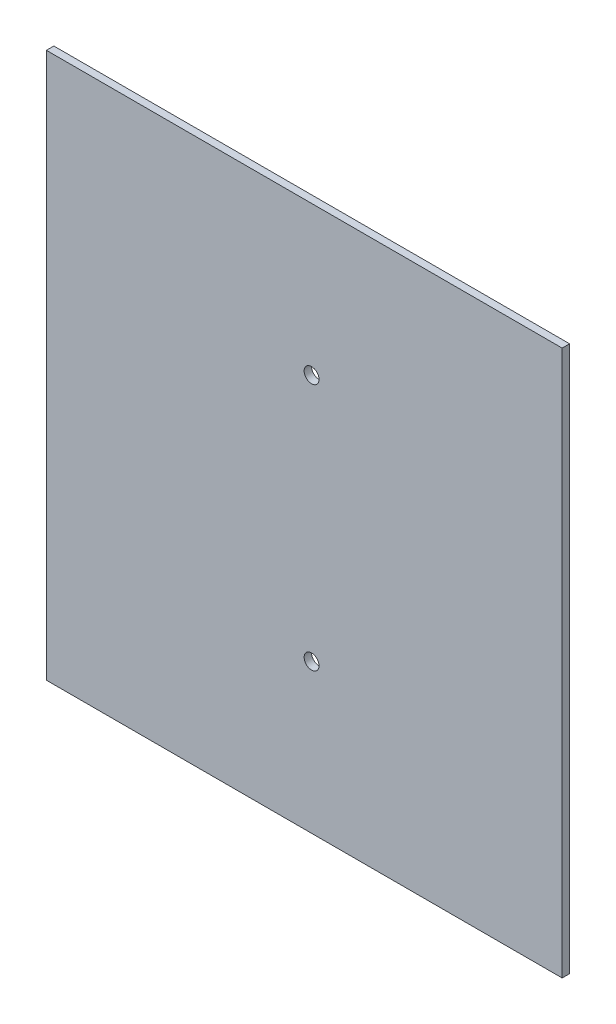
ISO-10303-21;
HEADER;
FILE_DESCRIPTION(('STEP AP214'),'2;1');
FILE_NAME('part.step','',(''),(''),'','','');
FILE_SCHEMA(('AUTOMOTIVE_DESIGN { 1 0 10303 214 1 1 1 1 }'));
ENDSEC;
DATA;
#1=APPLICATION_CONTEXT('core data for automotive mechanical design processes');
#2=APPLICATION_PROTOCOL_DEFINITION('international standard','automotive_design',2000,#1);
#3=PRODUCT_CONTEXT('',#1,'mechanical');
#4=PRODUCT('Part','Part','',(#3));
#5=PRODUCT_RELATED_PRODUCT_CATEGORY('part','',(#4));
#6=PRODUCT_DEFINITION_FORMATION('','',#4);
#7=PRODUCT_DEFINITION_CONTEXT('part definition',#1,'design');
#8=PRODUCT_DEFINITION('design','',#6,#7);
#9=PRODUCT_DEFINITION_SHAPE('','',#8);
#10=(LENGTH_UNIT() NAMED_UNIT(*) SI_UNIT(.MILLI.,.METRE.));
#11=(NAMED_UNIT(*) PLANE_ANGLE_UNIT() SI_UNIT($,.RADIAN.));
#12=(NAMED_UNIT(*) SI_UNIT($,.STERADIAN.) SOLID_ANGLE_UNIT());
#13=UNCERTAINTY_MEASURE_WITH_UNIT(LENGTH_MEASURE(1.E-05),#10,'distance_accuracy_value','');
#14=(GEOMETRIC_REPRESENTATION_CONTEXT(3) GLOBAL_UNCERTAINTY_ASSIGNED_CONTEXT((#13)) GLOBAL_UNIT_ASSIGNED_CONTEXT((#10,
#11,#12)) REPRESENTATION_CONTEXT('',''));
#15=CARTESIAN_POINT('',(0.,0.,0.));
#16=DIRECTION('',(0.,0.,1.));
#17=DIRECTION('',(1.,0.,0.));
#18=AXIS2_PLACEMENT_3D('',#15,#16,#17);
#19=CARTESIAN_POINT('',(0.,0.,1.5));
#20=DIRECTION('',(-1.,0.,0.));
#21=DIRECTION('',(0.,0.,1.));
#22=AXIS2_PLACEMENT_3D('',#19,#20,#21);
#23=PLANE('',#22);
#24=DIRECTION('',(0.,1.,0.));
#25=VECTOR('',#24,1.);
#26=CARTESIAN_POINT('',(0.,0.,0.));
#27=LINE('',#26,#25);
#28=CARTESIAN_POINT('',(0.,0.,0.));
#29=VERTEX_POINT('',#28);
#30=CARTESIAN_POINT('',(0.,110.,0.));
#31=VERTEX_POINT('',#30);
#32=EDGE_CURVE('E101',#29,#31,#27,.T.);
#33=ORIENTED_EDGE('',*,*,#32,.F.);
#34=DIRECTION('',(0.,0.,-1.));
#35=VECTOR('',#34,1.);
#36=CARTESIAN_POINT('',(0.,0.,1.5));
#37=LINE('',#36,#35);
#38=CARTESIAN_POINT('',(0.,0.,1.5));
#39=VERTEX_POINT('',#38);
#40=EDGE_CURVE('E11',#39,#29,#37,.T.);
#41=ORIENTED_EDGE('',*,*,#40,.F.);
#42=DIRECTION('',(0.,1.,0.));
#43=VECTOR('',#42,1.);
#44=CARTESIAN_POINT('',(0.,0.,1.5));
#45=LINE('',#44,#43);
#46=CARTESIAN_POINT('',(0.,110.,1.5));
#47=VERTEX_POINT('',#46);
#48=EDGE_CURVE('E95',#39,#47,#45,.T.);
#49=ORIENTED_EDGE('',*,*,#48,.T.);
#50=DIRECTION('',(0.,0.,-1.));
#51=VECTOR('',#50,1.);
#52=CARTESIAN_POINT('',(0.,110.,1.5));
#53=LINE('',#52,#51);
#54=EDGE_CURVE('E74',#47,#31,#53,.T.);
#55=ORIENTED_EDGE('',*,*,#54,.T.);
#56=EDGE_LOOP('',(#33,#41,#49,#55));
#57=FACE_BOUND('',#56,.T.);
#58=ADVANCED_FACE('F33',(#57),#23,.T.);
#59=CARTESIAN_POINT('',(0.,0.,1.5));
#60=DIRECTION('',(0.,1.,0.));
#61=DIRECTION('',(0.,0.,1.));
#62=AXIS2_PLACEMENT_3D('',#59,#60,#61);
#63=PLANE('',#62);
#64=DIRECTION('',(1.,0.,0.));
#65=VECTOR('',#64,1.);
#66=CARTESIAN_POINT('',(0.,0.,0.));
#67=LINE('',#66,#65);
#68=CARTESIAN_POINT('',(104.,0.,0.));
#69=VERTEX_POINT('',#68);
#70=EDGE_CURVE('E66',#29,#69,#67,.T.);
#71=ORIENTED_EDGE('',*,*,#70,.T.);
#72=DIRECTION('',(0.,0.,-1.));
#73=VECTOR('',#72,1.);
#74=CARTESIAN_POINT('',(104.,0.,1.5));
#75=LINE('',#74,#73);
#76=CARTESIAN_POINT('',(104.,0.,1.5));
#77=VERTEX_POINT('',#76);
#78=EDGE_CURVE('E42',#77,#69,#75,.T.);
#79=ORIENTED_EDGE('',*,*,#78,.F.);
#80=DIRECTION('',(1.,0.,0.));
#81=VECTOR('',#80,1.);
#82=CARTESIAN_POINT('',(0.,0.,1.5));
#83=LINE('',#82,#81);
#84=EDGE_CURVE('E84',#39,#77,#83,.T.);
#85=ORIENTED_EDGE('',*,*,#84,.F.);
#86=ORIENTED_EDGE('',*,*,#40,.T.);
#87=EDGE_LOOP('',(#71,#79,#85,#86));
#88=FACE_BOUND('',#87,.T.);
#89=ADVANCED_FACE('F128',(#88),#63,.F.);
#90=CARTESIAN_POINT('',(104.,0.,1.5));
#91=DIRECTION('',(-1.,0.,0.));
#92=DIRECTION('',(0.,0.,1.));
#93=AXIS2_PLACEMENT_3D('',#90,#91,#92);
#94=PLANE('',#93);
#95=DIRECTION('',(0.,1.,0.));
#96=VECTOR('',#95,1.);
#97=CARTESIAN_POINT('',(104.,0.,0.));
#98=LINE('',#97,#96);
#99=CARTESIAN_POINT('',(104.,110.,0.));
#100=VERTEX_POINT('',#99);
#101=EDGE_CURVE('E91',#69,#100,#98,.T.);
#102=ORIENTED_EDGE('',*,*,#101,.T.);
#103=DIRECTION('',(0.,0.,-1.));
#104=VECTOR('',#103,1.);
#105=CARTESIAN_POINT('',(104.,110.,1.5));
#106=LINE('',#105,#104);
#107=CARTESIAN_POINT('',(104.,110.,1.5));
#108=VERTEX_POINT('',#107);
#109=EDGE_CURVE('E88',#108,#100,#106,.T.);
#110=ORIENTED_EDGE('',*,*,#109,.F.);
#111=DIRECTION('',(0.,1.,0.));
#112=VECTOR('',#111,1.);
#113=CARTESIAN_POINT('',(104.,0.,1.5));
#114=LINE('',#113,#112);
#115=EDGE_CURVE('E79',#77,#108,#114,.T.);
#116=ORIENTED_EDGE('',*,*,#115,.F.);
#117=ORIENTED_EDGE('',*,*,#78,.T.);
#118=EDGE_LOOP('',(#102,#110,#116,#117));
#119=FACE_BOUND('',#118,.T.);
#120=ADVANCED_FACE('F89',(#119),#94,.F.);
#121=CARTESIAN_POINT('',(0.,110.,1.5));
#122=DIRECTION('',(0.,1.,0.));
#123=DIRECTION('',(0.,0.,1.));
#124=AXIS2_PLACEMENT_3D('',#121,#122,#123);
#125=PLANE('',#124);
#126=DIRECTION('',(1.,0.,0.));
#127=VECTOR('',#126,1.);
#128=CARTESIAN_POINT('',(0.,110.,0.));
#129=LINE('',#128,#127);
#130=EDGE_CURVE('E104',#31,#100,#129,.T.);
#131=ORIENTED_EDGE('',*,*,#130,.F.);
#132=ORIENTED_EDGE('',*,*,#54,.F.);
#133=DIRECTION('',(1.,0.,0.));
#134=VECTOR('',#133,1.);
#135=CARTESIAN_POINT('',(0.,110.,1.5));
#136=LINE('',#135,#134);
#137=EDGE_CURVE('E83',#47,#108,#136,.T.);
#138=ORIENTED_EDGE('',*,*,#137,.T.);
#139=ORIENTED_EDGE('',*,*,#109,.T.);
#140=EDGE_LOOP('',(#131,#132,#138,#139));
#141=FACE_BOUND('',#140,.T.);
#142=ADVANCED_FACE('F94',(#141),#125,.T.);
#143=CARTESIAN_POINT('',(0.,0.,1.5));
#144=DIRECTION('',(0.,0.,-1.));
#145=DIRECTION('',(-1.,0.,0.));
#146=AXIS2_PLACEMENT_3D('',#143,#144,#145);
#147=PLANE('',#146);
#148=CARTESIAN_POINT('',(53.4720850740263,80.,1.5));
#149=DIRECTION('',(0.,0.,-1.));
#150=DIRECTION('',(0.,1.,0.));
#151=AXIS2_PLACEMENT_3D('',#148,#149,#150);
#152=CIRCLE('',#151,1.5);
#153=CARTESIAN_POINT('',(53.4720850740263,81.5,1.5));
#154=VERTEX_POINT('',#153);
#155=EDGE_CURVE('E172',#154,#154,#152,.T.);
#156=ORIENTED_EDGE('',*,*,#155,.T.);
#157=EDGE_LOOP('',(#156));
#158=FACE_BOUND('',#157,.T.);
#159=CARTESIAN_POINT('',(53.4720850740263,30.,1.50000000000001));
#160=DIRECTION('',(0.,0.,-1.));
#161=DIRECTION('',(0.,1.,0.));
#162=AXIS2_PLACEMENT_3D('',#159,#160,#161);
#163=CIRCLE('',#162,1.5);
#164=CARTESIAN_POINT('',(53.4720850740263,31.5,1.50000000000001));
#165=VERTEX_POINT('',#164);
#166=EDGE_CURVE('E174',#165,#165,#163,.T.);
#167=ORIENTED_EDGE('',*,*,#166,.T.);
#168=EDGE_LOOP('',(#167));
#169=FACE_BOUND('',#168,.T.);
#170=ORIENTED_EDGE('',*,*,#48,.F.);
#171=ORIENTED_EDGE('',*,*,#84,.T.);
#172=ORIENTED_EDGE('',*,*,#115,.T.);
#173=ORIENTED_EDGE('',*,*,#137,.F.);
#174=EDGE_LOOP('',(#170,#171,#172,#173));
#175=FACE_BOUND('',#174,.T.);
#176=ADVANCED_FACE('F82',(#158,#169,#175),#147,.F.);
#177=CARTESIAN_POINT('',(0.,0.,0.));
#178=DIRECTION('',(0.,0.,-1.));
#179=DIRECTION('',(-1.,0.,0.));
#180=AXIS2_PLACEMENT_3D('',#177,#178,#179);
#181=PLANE('',#180);
#182=CARTESIAN_POINT('',(53.4720850740263,80.,0.));
#183=DIRECTION('',(0.,0.,-1.));
#184=DIRECTION('',(-1.,0.,0.));
#185=AXIS2_PLACEMENT_3D('',#182,#183,#184);
#186=CIRCLE('',#185,1.5);
#187=CARTESIAN_POINT('',(51.9720850740263,80.,0.));
#188=VERTEX_POINT('',#187);
#189=EDGE_CURVE('E36',#188,#188,#186,.T.);
#190=ORIENTED_EDGE('',*,*,#189,.F.);
#191=EDGE_LOOP('',(#190));
#192=FACE_BOUND('',#191,.T.);
#193=CARTESIAN_POINT('',(53.4720850740263,30.,0.));
#194=DIRECTION('',(0.,0.,-1.));
#195=DIRECTION('',(-1.,0.,0.));
#196=AXIS2_PLACEMENT_3D('',#193,#194,#195);
#197=CIRCLE('',#196,1.5);
#198=CARTESIAN_POINT('',(51.9720850740263,30.,0.));
#199=VERTEX_POINT('',#198);
#200=EDGE_CURVE('E105',#199,#199,#197,.T.);
#201=ORIENTED_EDGE('',*,*,#200,.F.);
#202=EDGE_LOOP('',(#201));
#203=FACE_BOUND('',#202,.T.);
#204=ORIENTED_EDGE('',*,*,#32,.T.);
#205=ORIENTED_EDGE('',*,*,#130,.T.);
#206=ORIENTED_EDGE('',*,*,#101,.F.);
#207=ORIENTED_EDGE('',*,*,#70,.F.);
#208=EDGE_LOOP('',(#204,#205,#206,#207));
#209=FACE_BOUND('',#208,.T.);
#210=ADVANCED_FACE('F110',(#192,#203,#209),#181,.T.);
#211=CARTESIAN_POINT('',(53.4720850740263,30.,-1.49999999999999));
#212=DIRECTION('',(0.,0.,-1.));
#213=DIRECTION('',(0.,1.,0.));
#214=AXIS2_PLACEMENT_3D('',#211,#212,#213);
#215=CYLINDRICAL_SURFACE('',#214,1.5);
#216=ORIENTED_EDGE('',*,*,#200,.T.);
#217=EDGE_LOOP('',(#216));
#218=FACE_BOUND('',#217,.T.);
#219=ORIENTED_EDGE('',*,*,#166,.F.);
#220=EDGE_LOOP('',(#219));
#221=FACE_BOUND('',#220,.T.);
#222=ADVANCED_FACE('F112',(#218,#221),#215,.F.);
#223=CARTESIAN_POINT('',(53.4720850740263,80.,-1.5));
#224=DIRECTION('',(0.,0.,-1.));
#225=DIRECTION('',(0.,1.,0.));
#226=AXIS2_PLACEMENT_3D('',#223,#224,#225);
#227=CYLINDRICAL_SURFACE('',#226,1.5);
#228=ORIENTED_EDGE('',*,*,#189,.T.);
#229=EDGE_LOOP('',(#228));
#230=FACE_BOUND('',#229,.T.);
#231=ORIENTED_EDGE('',*,*,#155,.F.);
#232=EDGE_LOOP('',(#231));
#233=FACE_BOUND('',#232,.T.);
#234=ADVANCED_FACE('F119',(#230,#233),#227,.F.);
#235=CLOSED_SHELL('',(#58,#89,#120,#142,#176,#210,#222,#234));
#236=MANIFOLD_SOLID_BREP('B2',#235);
#237=ADVANCED_BREP_SHAPE_REPRESENTATION('',(#18,#236),#14);
#238=SHAPE_DEFINITION_REPRESENTATION(#9,#237);
ENDSEC;
END-ISO-10303-21;
